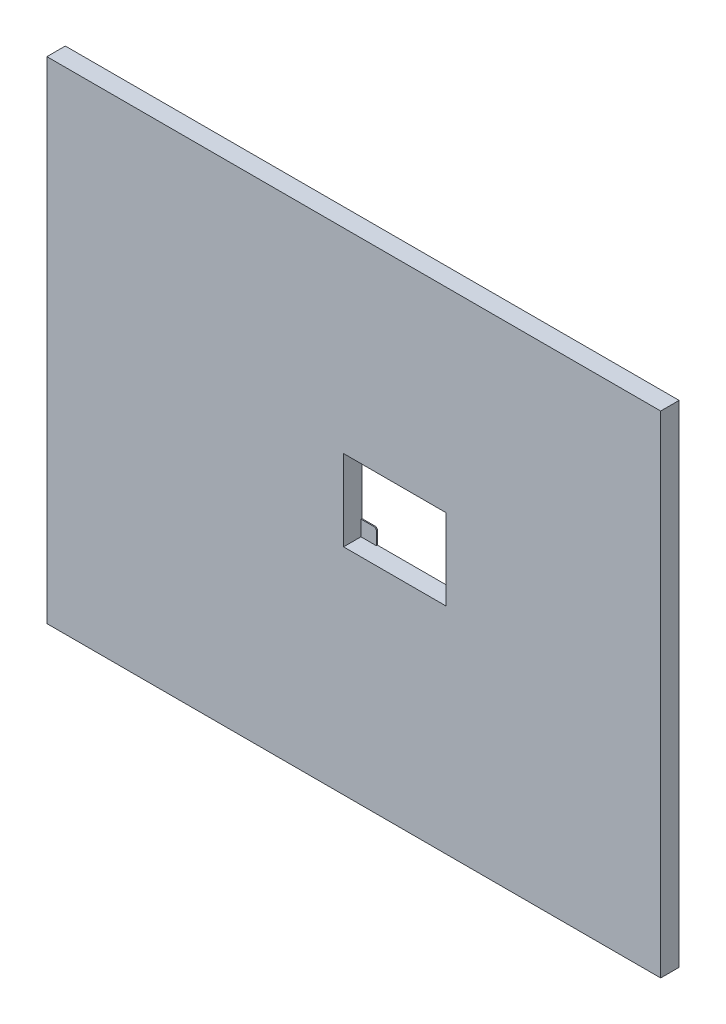
ISO-10303-21;
HEADER;
FILE_DESCRIPTION(('STEP AP214'),'2;1');
FILE_NAME('part.step','',(''),(''),'','','');
FILE_SCHEMA(('AUTOMOTIVE_DESIGN { 1 0 10303 214 1 1 1 1 }'));
ENDSEC;
DATA;
#1=APPLICATION_CONTEXT('core data for automotive mechanical design processes');
#2=APPLICATION_PROTOCOL_DEFINITION('international standard','automotive_design',2000,#1);
#3=PRODUCT_CONTEXT('',#1,'mechanical');
#4=PRODUCT('Part','Part','',(#3));
#5=PRODUCT_RELATED_PRODUCT_CATEGORY('part','',(#4));
#6=PRODUCT_DEFINITION_FORMATION('','',#4);
#7=PRODUCT_DEFINITION_CONTEXT('part definition',#1,'design');
#8=PRODUCT_DEFINITION('design','',#6,#7);
#9=PRODUCT_DEFINITION_SHAPE('','',#8);
#10=(LENGTH_UNIT() NAMED_UNIT(*) SI_UNIT(.MILLI.,.METRE.));
#11=(NAMED_UNIT(*) PLANE_ANGLE_UNIT() SI_UNIT($,.RADIAN.));
#12=(NAMED_UNIT(*) SI_UNIT($,.STERADIAN.) SOLID_ANGLE_UNIT());
#13=UNCERTAINTY_MEASURE_WITH_UNIT(LENGTH_MEASURE(1.E-05),#10,'distance_accuracy_value','');
#14=(GEOMETRIC_REPRESENTATION_CONTEXT(3) GLOBAL_UNCERTAINTY_ASSIGNED_CONTEXT((#13)) GLOBAL_UNIT_ASSIGNED_CONTEXT((#10,
#11,#12)) REPRESENTATION_CONTEXT('',''));
#15=CARTESIAN_POINT('',(0.,0.,0.));
#16=DIRECTION('',(0.,0.,1.));
#17=DIRECTION('',(1.,0.,0.));
#18=AXIS2_PLACEMENT_3D('',#15,#16,#17);
#19=CARTESIAN_POINT('',(0.,0.,1.));
#20=DIRECTION('',(0.,0.,-1.));
#21=DIRECTION('',(-1.,0.,0.));
#22=AXIS2_PLACEMENT_3D('',#19,#20,#21);
#23=PLANE('',#22);
#24=DIRECTION('',(-1.,0.,0.));
#25=VECTOR('',#24,1.);
#26=CARTESIAN_POINT('',(0.,-15.0000000000001,1.));
#27=LINE('',#26,#25);
#28=CARTESIAN_POINT('',(90.0000000000001,-15.0000000000001,1.));
#29=VERTEX_POINT('',#28);
#30=CARTESIAN_POINT('',(77.0000000000001,-15.0000000000001,1.));
#31=VERTEX_POINT('',#30);
#32=EDGE_CURVE('E388',#29,#31,#27,.T.);
#33=ORIENTED_EDGE('',*,*,#32,.T.);
#34=CARTESIAN_POINT('',(77.0000000000001,-17.0000000000001,1.));
#35=DIRECTION('',(0.,0.,-1.));
#36=DIRECTION('',(-1.,0.,0.));
#37=AXIS2_PLACEMENT_3D('',#34,#35,#36);
#38=CIRCLE('',#37,2.);
#39=CARTESIAN_POINT('',(75.0000000000001,-17.0000000000001,1.));
#40=VERTEX_POINT('',#39);
#41=EDGE_CURVE('E337',#31,#40,#38,.F.);
#42=ORIENTED_EDGE('',*,*,#41,.T.);
#43=DIRECTION('',(0.,1.,0.));
#44=VECTOR('',#43,1.);
#45=CARTESIAN_POINT('',(75.,0.,1.));
#46=LINE('',#45,#44);
#47=CARTESIAN_POINT('',(75.0000000000001,-30.0000000000001,1.));
#48=VERTEX_POINT('',#47);
#49=EDGE_CURVE('E219',#48,#40,#46,.T.);
#50=ORIENTED_EDGE('',*,*,#49,.F.);
#51=DIRECTION('',(1.,0.,0.));
#52=VECTOR('',#51,1.);
#53=CARTESIAN_POINT('',(-9.99999999999995,-30.0000000000001,1.));
#54=LINE('',#53,#52);
#55=CARTESIAN_POINT('',(90.0000000000001,-30.0000000000001,1.));
#56=VERTEX_POINT('',#55);
#57=EDGE_CURVE('E227',#48,#56,#54,.T.);
#58=ORIENTED_EDGE('',*,*,#57,.T.);
#59=DIRECTION('',(0.,1.,0.));
#60=VECTOR('',#59,1.);
#61=CARTESIAN_POINT('',(90.0000000000001,-30.0000000000001,1.));
#62=LINE('',#61,#60);
#63=EDGE_CURVE('E229',#56,#29,#62,.T.);
#64=ORIENTED_EDGE('',*,*,#63,.T.);
#65=EDGE_LOOP('',(#33,#42,#50,#58,#64));
#66=FACE_BOUND('',#65,.T.);
#67=ADVANCED_FACE('F37',(#66),#23,.F.);
#68=DIRECTION('',(0.,-1.,0.));
#69=VECTOR('',#68,1.);
#70=CARTESIAN_POINT('',(75.0000000000001,0.,1.));
#71=LINE('',#70,#69);
#72=CARTESIAN_POINT('',(75.0000000000001,48.9999999999999,1.));
#73=VERTEX_POINT('',#72);
#74=CARTESIAN_POINT('',(75.0000000000001,35.9999999999999,1.));
#75=VERTEX_POINT('',#74);
#76=EDGE_CURVE('E363',#73,#75,#71,.T.);
#77=ORIENTED_EDGE('',*,*,#76,.T.);
#78=CARTESIAN_POINT('',(77.0000000000001,35.9999999999999,1.));
#79=DIRECTION('',(0.,0.,-1.));
#80=DIRECTION('',(-1.,0.,0.));
#81=AXIS2_PLACEMENT_3D('',#78,#79,#80);
#82=CIRCLE('',#81,2.);
#83=CARTESIAN_POINT('',(77.0000000000001,33.9999999999999,1.));
#84=VERTEX_POINT('',#83);
#85=EDGE_CURVE('E344',#75,#84,#82,.F.);
#86=ORIENTED_EDGE('',*,*,#85,.T.);
#87=DIRECTION('',(-1.,0.,0.));
#88=VECTOR('',#87,1.);
#89=CARTESIAN_POINT('',(0.,33.9999999999999,1.));
#90=LINE('',#89,#88);
#91=CARTESIAN_POINT('',(90.0000000000001,34.,1.));
#92=VERTEX_POINT('',#91);
#93=EDGE_CURVE('E398',#92,#84,#90,.T.);
#94=ORIENTED_EDGE('',*,*,#93,.F.);
#95=CARTESIAN_POINT('',(90.0000000000001,48.9999999999999,1.));
#96=VERTEX_POINT('',#95);
#97=EDGE_CURVE('E226',#92,#96,#62,.T.);
#98=ORIENTED_EDGE('',*,*,#97,.T.);
#99=DIRECTION('',(-1.,0.,0.));
#100=VECTOR('',#99,1.);
#101=CARTESIAN_POINT('',(-9.99999999999995,48.9999999999999,1.));
#102=LINE('',#101,#100);
#103=EDGE_CURVE('E236',#96,#73,#102,.T.);
#104=ORIENTED_EDGE('',*,*,#103,.T.);
#105=EDGE_LOOP('',(#77,#86,#94,#98,#104));
#106=FACE_BOUND('',#105,.T.);
#107=ADVANCED_FACE('F405',(#106),#23,.F.);
#108=DIRECTION('',(1.,0.,0.));
#109=VECTOR('',#108,1.);
#110=CARTESIAN_POINT('',(0.,33.9999999999999,1.));
#111=LINE('',#110,#109);
#112=CARTESIAN_POINT('',(-9.99999999999995,33.9999999999999,1.));
#113=VERTEX_POINT('',#112);
#114=CARTESIAN_POINT('',(3.00000000000005,33.9999999999999,1.));
#115=VERTEX_POINT('',#114);
#116=EDGE_CURVE('E353',#113,#115,#111,.T.);
#117=ORIENTED_EDGE('',*,*,#116,.T.);
#118=CARTESIAN_POINT('',(3.00000000000005,35.9999999999999,1.));
#119=DIRECTION('',(0.,0.,-1.));
#120=DIRECTION('',(-1.,0.,0.));
#121=AXIS2_PLACEMENT_3D('',#118,#119,#120);
#122=CIRCLE('',#121,2.);
#123=CARTESIAN_POINT('',(5.00000000000005,35.9999999999999,1.));
#124=VERTEX_POINT('',#123);
#125=EDGE_CURVE('E45',#115,#124,#122,.F.);
#126=ORIENTED_EDGE('',*,*,#125,.T.);
#127=DIRECTION('',(0.,-1.,0.));
#128=VECTOR('',#127,1.);
#129=CARTESIAN_POINT('',(5.00000000000005,0.,1.));
#130=LINE('',#129,#128);
#131=CARTESIAN_POINT('',(5.00000000000005,48.9999999999999,1.));
#132=VERTEX_POINT('',#131);
#133=EDGE_CURVE('E359',#132,#124,#130,.T.);
#134=ORIENTED_EDGE('',*,*,#133,.F.);
#135=CARTESIAN_POINT('',(-9.99999999999995,48.9999999999999,1.));
#136=VERTEX_POINT('',#135);
#137=EDGE_CURVE('E235',#132,#136,#102,.T.);
#138=ORIENTED_EDGE('',*,*,#137,.T.);
#139=DIRECTION('',(0.,-1.,0.));
#140=VECTOR('',#139,1.);
#141=CARTESIAN_POINT('',(-9.99999999999995,-30.0000000000001,1.));
#142=LINE('',#141,#140);
#143=EDGE_CURVE('E231',#136,#113,#142,.T.);
#144=ORIENTED_EDGE('',*,*,#143,.T.);
#145=EDGE_LOOP('',(#117,#126,#134,#138,#144));
#146=FACE_BOUND('',#145,.T.);
#147=ADVANCED_FACE('F357',(#146),#23,.F.);
#148=CARTESIAN_POINT('',(0.,0.,0.));
#149=DIRECTION('',(0.,0.,1.));
#150=DIRECTION('',(1.,0.,0.));
#151=AXIS2_PLACEMENT_3D('',#148,#149,#150);
#152=PLANE('',#151);
#153=DIRECTION('',(0.,1.,0.));
#154=VECTOR('',#153,1.);
#155=CARTESIAN_POINT('',(300.,240.,0.));
#156=LINE('',#155,#154);
#157=CARTESIAN_POINT('',(300.,-240.,0.));
#158=VERTEX_POINT('',#157);
#159=CARTESIAN_POINT('',(300.,240.,0.));
#160=VERTEX_POINT('',#159);
#161=EDGE_CURVE('E253',#158,#160,#156,.T.);
#162=ORIENTED_EDGE('',*,*,#161,.F.);
#163=DIRECTION('',(1.,0.,0.));
#164=VECTOR('',#163,1.);
#165=CARTESIAN_POINT('',(-300.,-240.,0.));
#166=LINE('',#165,#164);
#167=CARTESIAN_POINT('',(-300.,-240.,0.));
#168=VERTEX_POINT('',#167);
#169=EDGE_CURVE('E263',#168,#158,#166,.T.);
#170=ORIENTED_EDGE('',*,*,#169,.F.);
#171=DIRECTION('',(0.,-1.,0.));
#172=VECTOR('',#171,1.);
#173=CARTESIAN_POINT('',(-300.,240.,0.));
#174=LINE('',#173,#172);
#175=CARTESIAN_POINT('',(-300.,240.,0.));
#176=VERTEX_POINT('',#175);
#177=EDGE_CURVE('E274',#176,#168,#174,.T.);
#178=ORIENTED_EDGE('',*,*,#177,.F.);
#179=DIRECTION('',(-1.,0.,0.));
#180=VECTOR('',#179,1.);
#181=CARTESIAN_POINT('',(-300.,240.,0.));
#182=LINE('',#181,#180);
#183=EDGE_CURVE('E272',#160,#176,#182,.T.);
#184=ORIENTED_EDGE('',*,*,#183,.F.);
#185=EDGE_LOOP('',(#162,#170,#178,#184));
#186=FACE_BOUND('',#185,.T.);
#187=DIRECTION('',(1.,0.,0.));
#188=VECTOR('',#187,1.);
#189=CARTESIAN_POINT('',(0.,-15.0000000000001,0.));
#190=LINE('',#189,#188);
#191=CARTESIAN_POINT('',(-9.99999999999995,-15.0000000000001,0.));
#192=VERTEX_POINT('',#191);
#193=CARTESIAN_POINT('',(3.00000000000005,-15.0000000000001,0.));
#194=VERTEX_POINT('',#193);
#195=EDGE_CURVE('E316',#192,#194,#190,.T.);
#196=ORIENTED_EDGE('',*,*,#195,.T.);
#197=CARTESIAN_POINT('',(3.00000000000005,-17.0000000000001,0.));
#198=DIRECTION('',(0.,0.,1.));
#199=DIRECTION('',(1.,0.,0.));
#200=AXIS2_PLACEMENT_3D('',#197,#198,#199);
#201=CIRCLE('',#200,2.);
#202=CARTESIAN_POINT('',(5.00000000000005,-17.0000000000001,0.));
#203=VERTEX_POINT('',#202);
#204=EDGE_CURVE('E332',#194,#203,#201,.F.);
#205=ORIENTED_EDGE('',*,*,#204,.T.);
#206=DIRECTION('',(0.,1.,0.));
#207=VECTOR('',#206,1.);
#208=CARTESIAN_POINT('',(5.00000000000005,0.,0.));
#209=LINE('',#208,#207);
#210=CARTESIAN_POINT('',(5.00000000000005,-30.0000000000001,0.));
#211=VERTEX_POINT('',#210);
#212=EDGE_CURVE('E319',#211,#203,#209,.T.);
#213=ORIENTED_EDGE('',*,*,#212,.F.);
#214=DIRECTION('',(1.,0.,0.));
#215=VECTOR('',#214,1.);
#216=CARTESIAN_POINT('',(0.,-30.0000000000001,0.));
#217=LINE('',#216,#215);
#218=CARTESIAN_POINT('',(75.0000000000001,-30.0000000000001,0.));
#219=VERTEX_POINT('',#218);
#220=EDGE_CURVE('E205',#211,#219,#217,.T.);
#221=ORIENTED_EDGE('',*,*,#220,.T.);
#222=DIRECTION('',(0.,1.,0.));
#223=VECTOR('',#222,1.);
#224=CARTESIAN_POINT('',(75.,0.,0.));
#225=LINE('',#224,#223);
#226=CARTESIAN_POINT('',(75.0000000000001,-17.0000000000001,0.));
#227=VERTEX_POINT('',#226);
#228=EDGE_CURVE('E289',#219,#227,#225,.T.);
#229=ORIENTED_EDGE('',*,*,#228,.T.);
#230=CARTESIAN_POINT('',(77.0000000000001,-17.0000000000001,0.));
#231=DIRECTION('',(0.,0.,1.));
#232=DIRECTION('',(1.,0.,0.));
#233=AXIS2_PLACEMENT_3D('',#230,#231,#232);
#234=CIRCLE('',#233,2.);
#235=CARTESIAN_POINT('',(77.0000000000001,-15.0000000000001,0.));
#236=VERTEX_POINT('',#235);
#237=EDGE_CURVE('E330',#227,#236,#234,.F.);
#238=ORIENTED_EDGE('',*,*,#237,.T.);
#239=DIRECTION('',(-1.,0.,0.));
#240=VECTOR('',#239,1.);
#241=CARTESIAN_POINT('',(0.,-15.0000000000001,0.));
#242=LINE('',#241,#240);
#243=CARTESIAN_POINT('',(90.0000000000001,-15.0000000000001,0.));
#244=VERTEX_POINT('',#243);
#245=EDGE_CURVE('E292',#244,#236,#242,.T.);
#246=ORIENTED_EDGE('',*,*,#245,.F.);
#247=DIRECTION('',(0.,1.,0.));
#248=VECTOR('',#247,1.);
#249=CARTESIAN_POINT('',(90.0000000000001,0.,0.));
#250=LINE('',#249,#248);
#251=CARTESIAN_POINT('',(90.0000000000001,34.,0.));
#252=VERTEX_POINT('',#251);
#253=EDGE_CURVE('E295',#244,#252,#250,.T.);
#254=ORIENTED_EDGE('',*,*,#253,.T.);
#255=DIRECTION('',(-1.,0.,0.));
#256=VECTOR('',#255,1.);
#257=CARTESIAN_POINT('',(0.,33.9999999999999,0.));
#258=LINE('',#257,#256);
#259=CARTESIAN_POINT('',(77.0000000000001,33.9999999999999,0.));
#260=VERTEX_POINT('',#259);
#261=EDGE_CURVE('E298',#252,#260,#258,.T.);
#262=ORIENTED_EDGE('',*,*,#261,.T.);
#263=CARTESIAN_POINT('',(77.0000000000001,35.9999999999999,0.));
#264=DIRECTION('',(0.,0.,1.));
#265=DIRECTION('',(1.,0.,0.));
#266=AXIS2_PLACEMENT_3D('',#263,#264,#265);
#267=CIRCLE('',#266,2.);
#268=CARTESIAN_POINT('',(75.0000000000001,35.9999999999999,0.));
#269=VERTEX_POINT('',#268);
#270=EDGE_CURVE('E328',#260,#269,#267,.F.);
#271=ORIENTED_EDGE('',*,*,#270,.T.);
#272=DIRECTION('',(0.,-1.,0.));
#273=VECTOR('',#272,1.);
#274=CARTESIAN_POINT('',(75.0000000000001,0.,0.));
#275=LINE('',#274,#273);
#276=CARTESIAN_POINT('',(75.0000000000001,48.9999999999999,0.));
#277=VERTEX_POINT('',#276);
#278=EDGE_CURVE('E301',#277,#269,#275,.T.);
#279=ORIENTED_EDGE('',*,*,#278,.F.);
#280=DIRECTION('',(-1.,0.,0.));
#281=VECTOR('',#280,1.);
#282=CARTESIAN_POINT('',(0.,48.9999999999999,0.));
#283=LINE('',#282,#281);
#284=CARTESIAN_POINT('',(5.00000000000005,48.9999999999999,0.));
#285=VERTEX_POINT('',#284);
#286=EDGE_CURVE('E304',#277,#285,#283,.T.);
#287=ORIENTED_EDGE('',*,*,#286,.T.);
#288=DIRECTION('',(0.,-1.,0.));
#289=VECTOR('',#288,1.);
#290=CARTESIAN_POINT('',(5.00000000000005,0.,0.));
#291=LINE('',#290,#289);
#292=CARTESIAN_POINT('',(5.00000000000005,35.9999999999999,0.));
#293=VERTEX_POINT('',#292);
#294=EDGE_CURVE('E307',#285,#293,#291,.T.);
#295=ORIENTED_EDGE('',*,*,#294,.T.);
#296=CARTESIAN_POINT('',(3.00000000000005,35.9999999999999,0.));
#297=DIRECTION('',(0.,0.,1.));
#298=DIRECTION('',(1.,0.,0.));
#299=AXIS2_PLACEMENT_3D('',#296,#297,#298);
#300=CIRCLE('',#299,2.);
#301=CARTESIAN_POINT('',(3.00000000000005,33.9999999999999,0.));
#302=VERTEX_POINT('',#301);
#303=EDGE_CURVE('E326',#293,#302,#300,.F.);
#304=ORIENTED_EDGE('',*,*,#303,.T.);
#305=DIRECTION('',(1.,0.,0.));
#306=VECTOR('',#305,1.);
#307=CARTESIAN_POINT('',(0.,33.9999999999999,0.));
#308=LINE('',#307,#306);
#309=CARTESIAN_POINT('',(-9.99999999999995,33.9999999999999,0.));
#310=VERTEX_POINT('',#309);
#311=EDGE_CURVE('E310',#310,#302,#308,.T.);
#312=ORIENTED_EDGE('',*,*,#311,.F.);
#313=DIRECTION('',(0.,-1.,0.));
#314=VECTOR('',#313,1.);
#315=CARTESIAN_POINT('',(-9.99999999999995,0.,0.));
#316=LINE('',#315,#314);
#317=EDGE_CURVE('E313',#310,#192,#316,.T.);
#318=ORIENTED_EDGE('',*,*,#317,.T.);
#319=EDGE_LOOP('',(#196,#205,#213,#221,#229,#238,#246,#254,#262,#271,#279,#287,#295,#304,#312,#318));
#320=FACE_BOUND('',#319,.T.);
#321=ADVANCED_FACE('F421',(#186,#320),#152,.F.);
#322=CARTESIAN_POINT('',(300.,240.,18.));
#323=DIRECTION('',(-1.,0.,0.));
#324=DIRECTION('',(0.,-1.,0.));
#325=AXIS2_PLACEMENT_3D('',#322,#323,#324);
#326=PLANE('',#325);
#327=ORIENTED_EDGE('',*,*,#161,.T.);
#328=DIRECTION('',(0.,0.,-1.));
#329=VECTOR('',#328,1.);
#330=CARTESIAN_POINT('',(300.,240.,18.));
#331=LINE('',#330,#329);
#332=CARTESIAN_POINT('',(300.,240.,18.));
#333=VERTEX_POINT('',#332);
#334=EDGE_CURVE('E285',#333,#160,#331,.T.);
#335=ORIENTED_EDGE('',*,*,#334,.F.);
#336=DIRECTION('',(0.,1.,0.));
#337=VECTOR('',#336,1.);
#338=CARTESIAN_POINT('',(300.,240.,18.));
#339=LINE('',#338,#337);
#340=CARTESIAN_POINT('',(300.,-240.,18.));
#341=VERTEX_POINT('',#340);
#342=EDGE_CURVE('E259',#341,#333,#339,.T.);
#343=ORIENTED_EDGE('',*,*,#342,.F.);
#344=DIRECTION('',(0.,0.,-1.));
#345=VECTOR('',#344,1.);
#346=CARTESIAN_POINT('',(300.,-240.,18.));
#347=LINE('',#346,#345);
#348=EDGE_CURVE('E269',#341,#158,#347,.T.);
#349=ORIENTED_EDGE('',*,*,#348,.T.);
#350=EDGE_LOOP('',(#327,#335,#343,#349));
#351=FACE_BOUND('',#350,.T.);
#352=ADVANCED_FACE('F460',(#351),#326,.F.);
#353=CARTESIAN_POINT('',(-300.,240.,18.));
#354=DIRECTION('',(0.,-1.,0.));
#355=DIRECTION('',(0.,0.,-1.));
#356=AXIS2_PLACEMENT_3D('',#353,#354,#355);
#357=PLANE('',#356);
#358=ORIENTED_EDGE('',*,*,#183,.T.);
#359=DIRECTION('',(0.,0.,-1.));
#360=VECTOR('',#359,1.);
#361=CARTESIAN_POINT('',(-300.,240.,18.));
#362=LINE('',#361,#360);
#363=CARTESIAN_POINT('',(-300.,240.,18.));
#364=VERTEX_POINT('',#363);
#365=EDGE_CURVE('E282',#364,#176,#362,.T.);
#366=ORIENTED_EDGE('',*,*,#365,.F.);
#367=DIRECTION('',(-1.,0.,0.));
#368=VECTOR('',#367,1.);
#369=CARTESIAN_POINT('',(-300.,240.,18.));
#370=LINE('',#369,#368);
#371=EDGE_CURVE('E262',#333,#364,#370,.T.);
#372=ORIENTED_EDGE('',*,*,#371,.F.);
#373=ORIENTED_EDGE('',*,*,#334,.T.);
#374=EDGE_LOOP('',(#358,#366,#372,#373));
#375=FACE_BOUND('',#374,.T.);
#376=ADVANCED_FACE('F463',(#375),#357,.F.);
#377=CARTESIAN_POINT('',(-300.,240.,18.));
#378=DIRECTION('',(1.,0.,0.));
#379=DIRECTION('',(0.,1.,0.));
#380=AXIS2_PLACEMENT_3D('',#377,#378,#379);
#381=PLANE('',#380);
#382=ORIENTED_EDGE('',*,*,#177,.T.);
#383=DIRECTION('',(0.,0.,-1.));
#384=VECTOR('',#383,1.);
#385=CARTESIAN_POINT('',(-300.,-240.,18.));
#386=LINE('',#385,#384);
#387=CARTESIAN_POINT('',(-300.,-240.,18.));
#388=VERTEX_POINT('',#387);
#389=EDGE_CURVE('E279',#388,#168,#386,.T.);
#390=ORIENTED_EDGE('',*,*,#389,.F.);
#391=DIRECTION('',(0.,-1.,0.));
#392=VECTOR('',#391,1.);
#393=CARTESIAN_POINT('',(-300.,240.,18.));
#394=LINE('',#393,#392);
#395=EDGE_CURVE('E265',#364,#388,#394,.T.);
#396=ORIENTED_EDGE('',*,*,#395,.F.);
#397=ORIENTED_EDGE('',*,*,#365,.T.);
#398=EDGE_LOOP('',(#382,#390,#396,#397));
#399=FACE_BOUND('',#398,.T.);
#400=ADVANCED_FACE('F468',(#399),#381,.F.);
#401=CARTESIAN_POINT('',(-300.,-240.,18.));
#402=DIRECTION('',(0.,1.,0.));
#403=DIRECTION('',(0.,0.,1.));
#404=AXIS2_PLACEMENT_3D('',#401,#402,#403);
#405=PLANE('',#404);
#406=ORIENTED_EDGE('',*,*,#169,.T.);
#407=ORIENTED_EDGE('',*,*,#348,.F.);
#408=DIRECTION('',(1.,0.,0.));
#409=VECTOR('',#408,1.);
#410=CARTESIAN_POINT('',(-300.,-240.,18.));
#411=LINE('',#410,#409);
#412=EDGE_CURVE('E267',#388,#341,#411,.T.);
#413=ORIENTED_EDGE('',*,*,#412,.F.);
#414=ORIENTED_EDGE('',*,*,#389,.T.);
#415=EDGE_LOOP('',(#406,#407,#413,#414));
#416=FACE_BOUND('',#415,.T.);
#417=ADVANCED_FACE('F452',(#416),#405,.F.);
#418=CARTESIAN_POINT('',(0.,0.,18.));
#419=DIRECTION('',(0.,0.,1.));
#420=DIRECTION('',(1.,0.,0.));
#421=AXIS2_PLACEMENT_3D('',#418,#419,#420);
#422=PLANE('',#421);
#423=DIRECTION('',(0.,-1.,0.));
#424=VECTOR('',#423,1.);
#425=CARTESIAN_POINT('',(-9.99999999999995,-30.0000000000001,18.));
#426=LINE('',#425,#424);
#427=CARTESIAN_POINT('',(-9.99999999999995,48.9999999999999,18.));
#428=VERTEX_POINT('',#427);
#429=CARTESIAN_POINT('',(-9.99999999999995,-30.0000000000001,18.));
#430=VERTEX_POINT('',#429);
#431=EDGE_CURVE('E240',#428,#430,#426,.T.);
#432=ORIENTED_EDGE('',*,*,#431,.F.);
#433=DIRECTION('',(-1.,0.,0.));
#434=VECTOR('',#433,1.);
#435=CARTESIAN_POINT('',(-9.99999999999995,48.9999999999999,18.));
#436=LINE('',#435,#434);
#437=CARTESIAN_POINT('',(90.0000000000001,48.9999999999999,18.));
#438=VERTEX_POINT('',#437);
#439=EDGE_CURVE('E248',#438,#428,#436,.T.);
#440=ORIENTED_EDGE('',*,*,#439,.F.);
#441=DIRECTION('',(0.,1.,0.));
#442=VECTOR('',#441,1.);
#443=CARTESIAN_POINT('',(90.0000000000001,-30.0000000000001,18.));
#444=LINE('',#443,#442);
#445=CARTESIAN_POINT('',(90.0000000000001,-30.0000000000001,18.));
#446=VERTEX_POINT('',#445);
#447=EDGE_CURVE('E245',#446,#438,#444,.T.);
#448=ORIENTED_EDGE('',*,*,#447,.F.);
#449=DIRECTION('',(1.,0.,0.));
#450=VECTOR('',#449,1.);
#451=CARTESIAN_POINT('',(-9.99999999999995,-30.0000000000001,18.));
#452=LINE('',#451,#450);
#453=EDGE_CURVE('E242',#430,#446,#452,.T.);
#454=ORIENTED_EDGE('',*,*,#453,.F.);
#455=EDGE_LOOP('',(#432,#440,#448,#454));
#456=FACE_BOUND('',#455,.T.);
#457=ORIENTED_EDGE('',*,*,#342,.T.);
#458=ORIENTED_EDGE('',*,*,#371,.T.);
#459=ORIENTED_EDGE('',*,*,#395,.T.);
#460=ORIENTED_EDGE('',*,*,#412,.T.);
#461=EDGE_LOOP('',(#457,#458,#459,#460));
#462=FACE_BOUND('',#461,.T.);
#463=ADVANCED_FACE('F448',(#456,#462),#422,.T.);
#464=CARTESIAN_POINT('',(-9.99999999999995,-30.0000000000001,1.));
#465=DIRECTION('',(-1.,0.,0.));
#466=DIRECTION('',(0.,0.,1.));
#467=AXIS2_PLACEMENT_3D('',#464,#465,#466);
#468=PLANE('',#467);
#469=ORIENTED_EDGE('',*,*,#431,.T.);
#470=DIRECTION('',(0.,0.,1.));
#471=VECTOR('',#470,1.);
#472=CARTESIAN_POINT('',(-9.99999999999995,-30.0000000000001,1.));
#473=LINE('',#472,#471);
#474=CARTESIAN_POINT('',(-9.99999999999995,-30.0000000000001,1.));
#475=VERTEX_POINT('',#474);
#476=EDGE_CURVE('E239',#475,#430,#473,.T.);
#477=ORIENTED_EDGE('',*,*,#476,.F.);
#478=CARTESIAN_POINT('',(-9.99999999999995,-15.0000000000001,1.));
#479=VERTEX_POINT('',#478);
#480=EDGE_CURVE('E224',#479,#475,#142,.T.);
#481=ORIENTED_EDGE('',*,*,#480,.F.);
#482=DIRECTION('',(0.,0.,1.));
#483=VECTOR('',#482,1.);
#484=CARTESIAN_POINT('',(-9.99999999999995,-15.0000000000001,-9.));
#485=LINE('',#484,#483);
#486=EDGE_CURVE('E243',#192,#479,#485,.T.);
#487=ORIENTED_EDGE('',*,*,#486,.F.);
#488=ORIENTED_EDGE('',*,*,#317,.F.);
#489=DIRECTION('',(0.,0.,1.));
#490=VECTOR('',#489,1.);
#491=CARTESIAN_POINT('',(-9.99999999999995,33.9999999999999,-9.));
#492=LINE('',#491,#490);
#493=EDGE_CURVE('E368',#310,#113,#492,.T.);
#494=ORIENTED_EDGE('',*,*,#493,.T.);
#495=ORIENTED_EDGE('',*,*,#143,.F.);
#496=DIRECTION('',(0.,0.,1.));
#497=VECTOR('',#496,1.);
#498=CARTESIAN_POINT('',(-9.99999999999995,48.9999999999999,1.));
#499=LINE('',#498,#497);
#500=EDGE_CURVE('E251',#136,#428,#499,.T.);
#501=ORIENTED_EDGE('',*,*,#500,.T.);
#502=EDGE_LOOP('',(#469,#477,#481,#487,#488,#494,#495,#501));
#503=FACE_BOUND('',#502,.T.);
#504=ADVANCED_FACE('F437',(#503),#468,.F.);
#505=CARTESIAN_POINT('',(-9.99999999999995,48.9999999999999,1.));
#506=DIRECTION('',(0.,1.,0.));
#507=DIRECTION('',(0.,0.,1.));
#508=AXIS2_PLACEMENT_3D('',#505,#506,#507);
#509=PLANE('',#508);
#510=ORIENTED_EDGE('',*,*,#439,.T.);
#511=ORIENTED_EDGE('',*,*,#500,.F.);
#512=ORIENTED_EDGE('',*,*,#137,.F.);
#513=DIRECTION('',(0.,0.,1.));
#514=VECTOR('',#513,1.);
#515=CARTESIAN_POINT('',(5.00000000000005,48.9999999999999,-9.));
#516=LINE('',#515,#514);
#517=EDGE_CURVE('E370',#285,#132,#516,.T.);
#518=ORIENTED_EDGE('',*,*,#517,.F.);
#519=ORIENTED_EDGE('',*,*,#286,.F.);
#520=DIRECTION('',(0.,0.,1.));
#521=VECTOR('',#520,1.);
#522=CARTESIAN_POINT('',(75.0000000000001,48.9999999999999,-9.));
#523=LINE('',#522,#521);
#524=EDGE_CURVE('E372',#277,#73,#523,.T.);
#525=ORIENTED_EDGE('',*,*,#524,.T.);
#526=ORIENTED_EDGE('',*,*,#103,.F.);
#527=DIRECTION('',(0.,0.,1.));
#528=VECTOR('',#527,1.);
#529=CARTESIAN_POINT('',(90.0000000000001,48.9999999999999,1.));
#530=LINE('',#529,#528);
#531=EDGE_CURVE('E254',#96,#438,#530,.T.);
#532=ORIENTED_EDGE('',*,*,#531,.T.);
#533=EDGE_LOOP('',(#510,#511,#512,#518,#519,#525,#526,#532));
#534=FACE_BOUND('',#533,.T.);
#535=ADVANCED_FACE('F444',(#534),#509,.F.);
#536=CARTESIAN_POINT('',(90.0000000000001,-30.0000000000001,1.));
#537=DIRECTION('',(1.,0.,0.));
#538=DIRECTION('',(0.,0.,-1.));
#539=AXIS2_PLACEMENT_3D('',#536,#537,#538);
#540=PLANE('',#539);
#541=ORIENTED_EDGE('',*,*,#447,.T.);
#542=ORIENTED_EDGE('',*,*,#531,.F.);
#543=ORIENTED_EDGE('',*,*,#97,.F.);
#544=DIRECTION('',(0.,0.,1.));
#545=VECTOR('',#544,1.);
#546=CARTESIAN_POINT('',(90.0000000000001,34.,-9.));
#547=LINE('',#546,#545);
#548=EDGE_CURVE('E374',#252,#92,#547,.T.);
#549=ORIENTED_EDGE('',*,*,#548,.F.);
#550=ORIENTED_EDGE('',*,*,#253,.F.);
#551=DIRECTION('',(0.,0.,1.));
#552=VECTOR('',#551,1.);
#553=CARTESIAN_POINT('',(90.0000000000001,-15.0000000000001,-9.));
#554=LINE('',#553,#552);
#555=EDGE_CURVE('E376',#244,#29,#554,.T.);
#556=ORIENTED_EDGE('',*,*,#555,.T.);
#557=ORIENTED_EDGE('',*,*,#63,.F.);
#558=DIRECTION('',(0.,0.,1.));
#559=VECTOR('',#558,1.);
#560=CARTESIAN_POINT('',(90.0000000000001,-30.0000000000001,1.));
#561=LINE('',#560,#559);
#562=EDGE_CURVE('E256',#56,#446,#561,.T.);
#563=ORIENTED_EDGE('',*,*,#562,.T.);
#564=EDGE_LOOP('',(#541,#542,#543,#549,#550,#556,#557,#563));
#565=FACE_BOUND('',#564,.T.);
#566=ADVANCED_FACE('F394',(#565),#540,.F.);
#567=CARTESIAN_POINT('',(-9.99999999999995,-30.0000000000001,1.));
#568=DIRECTION('',(0.,-1.,0.));
#569=DIRECTION('',(0.,0.,-1.));
#570=AXIS2_PLACEMENT_3D('',#567,#568,#569);
#571=PLANE('',#570);
#572=ORIENTED_EDGE('',*,*,#453,.T.);
#573=ORIENTED_EDGE('',*,*,#562,.F.);
#574=ORIENTED_EDGE('',*,*,#57,.F.);
#575=DIRECTION('',(0.,0.,1.));
#576=VECTOR('',#575,1.);
#577=CARTESIAN_POINT('',(75.0000000000001,-30.0000000000001,-9.));
#578=LINE('',#577,#576);
#579=EDGE_CURVE('E209',#219,#48,#578,.T.);
#580=ORIENTED_EDGE('',*,*,#579,.F.);
#581=ORIENTED_EDGE('',*,*,#220,.F.);
#582=DIRECTION('',(0.,0.,1.));
#583=VECTOR('',#582,1.);
#584=CARTESIAN_POINT('',(5.00000000000005,-30.0000000000001,-9.));
#585=LINE('',#584,#583);
#586=CARTESIAN_POINT('',(5.00000000000005,-30.0000000000001,1.));
#587=VERTEX_POINT('',#586);
#588=EDGE_CURVE('E197',#211,#587,#585,.T.);
#589=ORIENTED_EDGE('',*,*,#588,.T.);
#590=EDGE_CURVE('E203',#475,#587,#54,.T.);
#591=ORIENTED_EDGE('',*,*,#590,.F.);
#592=ORIENTED_EDGE('',*,*,#476,.T.);
#593=EDGE_LOOP('',(#572,#573,#574,#580,#581,#589,#591,#592));
#594=FACE_BOUND('',#593,.T.);
#595=ADVANCED_FACE('F200',(#594),#571,.F.);
#596=DIRECTION('',(0.,1.,0.));
#597=VECTOR('',#596,1.);
#598=CARTESIAN_POINT('',(5.00000000000005,0.,1.));
#599=LINE('',#598,#597);
#600=CARTESIAN_POINT('',(5.00000000000005,-17.0000000000001,1.));
#601=VERTEX_POINT('',#600);
#602=EDGE_CURVE('E214',#587,#601,#599,.T.);
#603=ORIENTED_EDGE('',*,*,#602,.T.);
#604=CARTESIAN_POINT('',(3.00000000000005,-17.0000000000001,1.));
#605=DIRECTION('',(0.,0.,-1.));
#606=DIRECTION('',(-1.,0.,0.));
#607=AXIS2_PLACEMENT_3D('',#604,#605,#606);
#608=CIRCLE('',#607,2.);
#609=CARTESIAN_POINT('',(3.00000000000005,-15.0000000000001,1.));
#610=VERTEX_POINT('',#609);
#611=EDGE_CURVE('E322',#601,#610,#608,.F.);
#612=ORIENTED_EDGE('',*,*,#611,.T.);
#613=DIRECTION('',(1.,0.,0.));
#614=VECTOR('',#613,1.);
#615=CARTESIAN_POINT('',(0.,-15.0000000000001,1.));
#616=LINE('',#615,#614);
#617=EDGE_CURVE('E210',#479,#610,#616,.T.);
#618=ORIENTED_EDGE('',*,*,#617,.F.);
#619=ORIENTED_EDGE('',*,*,#480,.T.);
#620=ORIENTED_EDGE('',*,*,#590,.T.);
#621=EDGE_LOOP('',(#603,#612,#618,#619,#620));
#622=FACE_BOUND('',#621,.T.);
#623=ADVANCED_FACE('F221',(#622),#23,.F.);
#624=CARTESIAN_POINT('',(5.00000000000005,0.,-9.));
#625=DIRECTION('',(1.,0.,0.));
#626=DIRECTION('',(0.,0.,-1.));
#627=AXIS2_PLACEMENT_3D('',#624,#625,#626);
#628=PLANE('',#627);
#629=ORIENTED_EDGE('',*,*,#212,.T.);
#630=DIRECTION('',(0.,0.,1.));
#631=VECTOR('',#630,1.);
#632=CARTESIAN_POINT('',(5.00000000000005,-17.0000000000001,1.));
#633=LINE('',#632,#631);
#634=EDGE_CURVE('E217',#203,#601,#633,.T.);
#635=ORIENTED_EDGE('',*,*,#634,.T.);
#636=ORIENTED_EDGE('',*,*,#602,.F.);
#637=ORIENTED_EDGE('',*,*,#588,.F.);
#638=EDGE_LOOP('',(#629,#635,#636,#637));
#639=FACE_BOUND('',#638,.T.);
#640=ADVANCED_FACE('F215',(#639),#628,.T.);
#641=CARTESIAN_POINT('',(0.,-15.0000000000001,-9.));
#642=DIRECTION('',(0.,-1.,0.));
#643=DIRECTION('',(0.,0.,-1.));
#644=AXIS2_PLACEMENT_3D('',#641,#642,#643);
#645=PLANE('',#644);
#646=ORIENTED_EDGE('',*,*,#617,.T.);
#647=DIRECTION('',(0.,0.,1.));
#648=VECTOR('',#647,1.);
#649=CARTESIAN_POINT('',(3.00000000000005,-15.0000000000001,0.));
#650=LINE('',#649,#648);
#651=EDGE_CURVE('E324',#610,#194,#650,.F.);
#652=ORIENTED_EDGE('',*,*,#651,.T.);
#653=ORIENTED_EDGE('',*,*,#195,.F.);
#654=ORIENTED_EDGE('',*,*,#486,.T.);
#655=EDGE_LOOP('',(#646,#652,#653,#654));
#656=FACE_BOUND('',#655,.T.);
#657=ADVANCED_FACE('F434',(#656),#645,.F.);
#658=CARTESIAN_POINT('',(0.,33.9999999999999,-9.));
#659=DIRECTION('',(0.,-1.,0.));
#660=DIRECTION('',(0.,0.,-1.));
#661=AXIS2_PLACEMENT_3D('',#658,#659,#660);
#662=PLANE('',#661);
#663=ORIENTED_EDGE('',*,*,#311,.T.);
#664=DIRECTION('',(0.,0.,1.));
#665=VECTOR('',#664,1.);
#666=CARTESIAN_POINT('',(3.00000000000005,33.9999999999999,1.));
#667=LINE('',#666,#665);
#668=EDGE_CURVE('E348',#302,#115,#667,.T.);
#669=ORIENTED_EDGE('',*,*,#668,.T.);
#670=ORIENTED_EDGE('',*,*,#116,.F.);
#671=ORIENTED_EDGE('',*,*,#493,.F.);
#672=EDGE_LOOP('',(#663,#669,#670,#671));
#673=FACE_BOUND('',#672,.T.);
#674=ADVANCED_FACE('F351',(#673),#662,.T.);
#675=CARTESIAN_POINT('',(5.00000000000005,0.,-9.));
#676=DIRECTION('',(-1.,0.,0.));
#677=DIRECTION('',(0.,-1.,0.));
#678=AXIS2_PLACEMENT_3D('',#675,#676,#677);
#679=PLANE('',#678);
#680=ORIENTED_EDGE('',*,*,#133,.T.);
#681=DIRECTION('',(0.,0.,1.));
#682=VECTOR('',#681,1.);
#683=CARTESIAN_POINT('',(5.00000000000005,35.9999999999999,0.));
#684=LINE('',#683,#682);
#685=EDGE_CURVE('E11',#124,#293,#684,.F.);
#686=ORIENTED_EDGE('',*,*,#685,.T.);
#687=ORIENTED_EDGE('',*,*,#294,.F.);
#688=ORIENTED_EDGE('',*,*,#517,.T.);
#689=EDGE_LOOP('',(#680,#686,#687,#688));
#690=FACE_BOUND('',#689,.T.);
#691=ADVANCED_FACE('F439',(#690),#679,.F.);
#692=CARTESIAN_POINT('',(75.0000000000001,0.,-9.));
#693=DIRECTION('',(-1.,0.,0.));
#694=DIRECTION('',(0.,0.,1.));
#695=AXIS2_PLACEMENT_3D('',#692,#693,#694);
#696=PLANE('',#695);
#697=ORIENTED_EDGE('',*,*,#278,.T.);
#698=DIRECTION('',(0.,0.,1.));
#699=VECTOR('',#698,1.);
#700=CARTESIAN_POINT('',(75.0000000000001,35.9999999999999,1.));
#701=LINE('',#700,#699);
#702=EDGE_CURVE('E341',#269,#75,#701,.T.);
#703=ORIENTED_EDGE('',*,*,#702,.T.);
#704=ORIENTED_EDGE('',*,*,#76,.F.);
#705=ORIENTED_EDGE('',*,*,#524,.F.);
#706=EDGE_LOOP('',(#697,#703,#704,#705));
#707=FACE_BOUND('',#706,.T.);
#708=ADVANCED_FACE('F410',(#707),#696,.T.);
#709=CARTESIAN_POINT('',(0.,33.9999999999999,-9.));
#710=DIRECTION('',(0.,1.,0.));
#711=DIRECTION('',(-1.,0.,0.));
#712=AXIS2_PLACEMENT_3D('',#709,#710,#711);
#713=PLANE('',#712);
#714=ORIENTED_EDGE('',*,*,#93,.T.);
#715=DIRECTION('',(0.,0.,1.));
#716=VECTOR('',#715,1.);
#717=CARTESIAN_POINT('',(77.0000000000001,33.9999999999999,0.));
#718=LINE('',#717,#716);
#719=EDGE_CURVE('E346',#84,#260,#718,.F.);
#720=ORIENTED_EDGE('',*,*,#719,.T.);
#721=ORIENTED_EDGE('',*,*,#261,.F.);
#722=ORIENTED_EDGE('',*,*,#548,.T.);
#723=EDGE_LOOP('',(#714,#720,#721,#722));
#724=FACE_BOUND('',#723,.T.);
#725=ADVANCED_FACE('F418',(#724),#713,.F.);
#726=CARTESIAN_POINT('',(0.,-15.0000000000001,-9.));
#727=DIRECTION('',(0.,1.,0.));
#728=DIRECTION('',(-1.,0.,0.));
#729=AXIS2_PLACEMENT_3D('',#726,#727,#728);
#730=PLANE('',#729);
#731=ORIENTED_EDGE('',*,*,#245,.T.);
#732=DIRECTION('',(0.,0.,1.));
#733=VECTOR('',#732,1.);
#734=CARTESIAN_POINT('',(77.0000000000001,-15.0000000000001,1.));
#735=LINE('',#734,#733);
#736=EDGE_CURVE('E334',#236,#31,#735,.T.);
#737=ORIENTED_EDGE('',*,*,#736,.T.);
#738=ORIENTED_EDGE('',*,*,#32,.F.);
#739=ORIENTED_EDGE('',*,*,#555,.F.);
#740=EDGE_LOOP('',(#731,#737,#738,#739));
#741=FACE_BOUND('',#740,.T.);
#742=ADVANCED_FACE('F424',(#741),#730,.T.);
#743=CARTESIAN_POINT('',(75.,0.,-9.));
#744=DIRECTION('',(1.,0.,0.));
#745=DIRECTION('',(0.,1.,0.));
#746=AXIS2_PLACEMENT_3D('',#743,#744,#745);
#747=PLANE('',#746);
#748=ORIENTED_EDGE('',*,*,#49,.T.);
#749=DIRECTION('',(0.,0.,1.));
#750=VECTOR('',#749,1.);
#751=CARTESIAN_POINT('',(75.0000000000001,-17.0000000000001,0.));
#752=LINE('',#751,#750);
#753=EDGE_CURVE('E339',#40,#227,#752,.F.);
#754=ORIENTED_EDGE('',*,*,#753,.T.);
#755=ORIENTED_EDGE('',*,*,#228,.F.);
#756=ORIENTED_EDGE('',*,*,#579,.T.);
#757=EDGE_LOOP('',(#748,#754,#755,#756));
#758=FACE_BOUND('',#757,.T.);
#759=ADVANCED_FACE('F382',(#758),#747,.F.);
#760=CARTESIAN_POINT('',(3.00000000000005,-17.0000000000001,-9.));
#761=DIRECTION('',(0.,0.,-1.));
#762=DIRECTION('',(-1.,0.,0.));
#763=AXIS2_PLACEMENT_3D('',#760,#761,#762);
#764=CYLINDRICAL_SURFACE('',#763,2.);
#765=ORIENTED_EDGE('',*,*,#204,.F.);
#766=ORIENTED_EDGE('',*,*,#651,.F.);
#767=ORIENTED_EDGE('',*,*,#611,.F.);
#768=ORIENTED_EDGE('',*,*,#634,.F.);
#769=EDGE_LOOP('',(#765,#766,#767,#768));
#770=FACE_BOUND('',#769,.T.);
#771=ADVANCED_FACE('F431',(#770),#764,.T.);
#772=CARTESIAN_POINT('',(77.0000000000001,-17.0000000000001,-9.));
#773=DIRECTION('',(0.,0.,-1.));
#774=DIRECTION('',(-1.,0.,0.));
#775=AXIS2_PLACEMENT_3D('',#772,#773,#774);
#776=CYLINDRICAL_SURFACE('',#775,2.);
#777=ORIENTED_EDGE('',*,*,#237,.F.);
#778=ORIENTED_EDGE('',*,*,#753,.F.);
#779=ORIENTED_EDGE('',*,*,#41,.F.);
#780=ORIENTED_EDGE('',*,*,#736,.F.);
#781=EDGE_LOOP('',(#777,#778,#779,#780));
#782=FACE_BOUND('',#781,.T.);
#783=ADVANCED_FACE('F428',(#782),#776,.T.);
#784=CARTESIAN_POINT('',(77.0000000000001,35.9999999999999,-9.));
#785=DIRECTION('',(0.,0.,-1.));
#786=DIRECTION('',(-1.,0.,0.));
#787=AXIS2_PLACEMENT_3D('',#784,#785,#786);
#788=CYLINDRICAL_SURFACE('',#787,2.);
#789=ORIENTED_EDGE('',*,*,#270,.F.);
#790=ORIENTED_EDGE('',*,*,#719,.F.);
#791=ORIENTED_EDGE('',*,*,#85,.F.);
#792=ORIENTED_EDGE('',*,*,#702,.F.);
#793=EDGE_LOOP('',(#789,#790,#791,#792));
#794=FACE_BOUND('',#793,.T.);
#795=ADVANCED_FACE('F415',(#794),#788,.T.);
#796=CARTESIAN_POINT('',(3.00000000000005,35.9999999999999,-9.));
#797=DIRECTION('',(0.,0.,-1.));
#798=DIRECTION('',(-1.,0.,0.));
#799=AXIS2_PLACEMENT_3D('',#796,#797,#798);
#800=CYLINDRICAL_SURFACE('',#799,2.);
#801=ORIENTED_EDGE('',*,*,#303,.F.);
#802=ORIENTED_EDGE('',*,*,#685,.F.);
#803=ORIENTED_EDGE('',*,*,#125,.F.);
#804=ORIENTED_EDGE('',*,*,#668,.F.);
#805=EDGE_LOOP('',(#801,#802,#803,#804));
#806=FACE_BOUND('',#805,.T.);
#807=ADVANCED_FACE('F39',(#806),#800,.T.);
#808=CLOSED_SHELL('',(#67,#107,#147,#321,#352,#376,#400,#417,#463,#504,#535,#566,#595,#623,#640,
#657,#674,#691,#708,#725,#742,#759,#771,#783,#795,#807));
#809=MANIFOLD_SOLID_BREP('B2',#808);
#810=ADVANCED_BREP_SHAPE_REPRESENTATION('',(#18,#809),#14);
#811=SHAPE_DEFINITION_REPRESENTATION(#9,#810);
ENDSEC;
END-ISO-10303-21;
